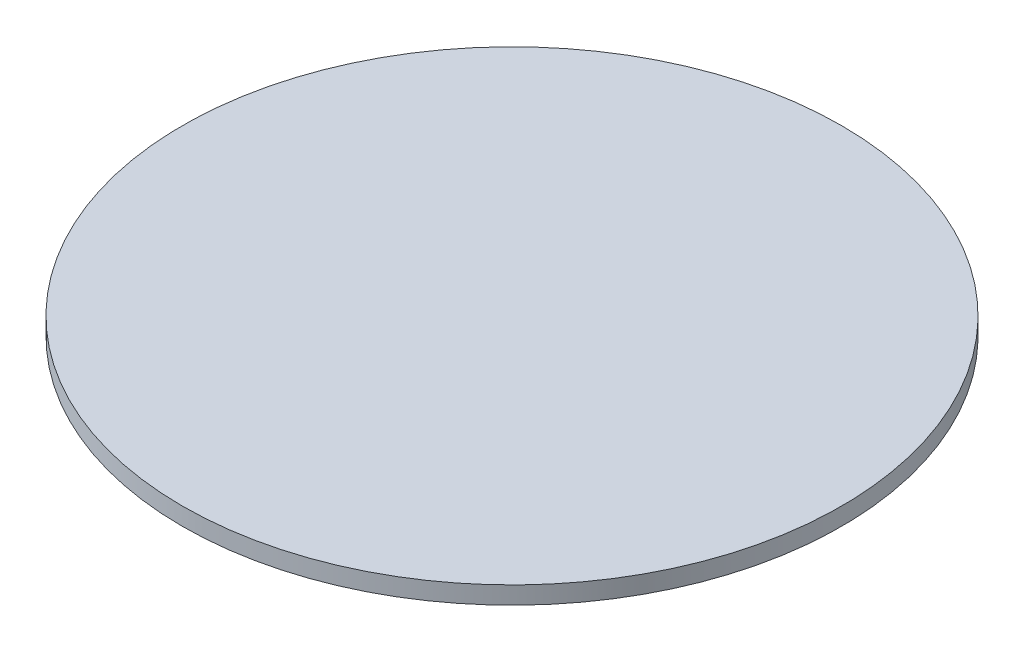
ISO-10303-21;
HEADER;
FILE_DESCRIPTION(('STEP AP214'),'2;1');
FILE_NAME('part.step','',(''),(''),'','','');
FILE_SCHEMA(('AUTOMOTIVE_DESIGN { 1 0 10303 214 1 1 1 1 }'));
ENDSEC;
DATA;
#1=APPLICATION_CONTEXT('core data for automotive mechanical design processes');
#2=APPLICATION_PROTOCOL_DEFINITION('international standard','automotive_design',2000,#1);
#3=PRODUCT_CONTEXT('',#1,'mechanical');
#4=PRODUCT('Part','Part','',(#3));
#5=PRODUCT_RELATED_PRODUCT_CATEGORY('part','',(#4));
#6=PRODUCT_DEFINITION_FORMATION('','',#4);
#7=PRODUCT_DEFINITION_CONTEXT('part definition',#1,'design');
#8=PRODUCT_DEFINITION('design','',#6,#7);
#9=PRODUCT_DEFINITION_SHAPE('','',#8);
#10=(LENGTH_UNIT() NAMED_UNIT(*) SI_UNIT(.MILLI.,.METRE.));
#11=(NAMED_UNIT(*) PLANE_ANGLE_UNIT() SI_UNIT($,.RADIAN.));
#12=(NAMED_UNIT(*) SI_UNIT($,.STERADIAN.) SOLID_ANGLE_UNIT());
#13=UNCERTAINTY_MEASURE_WITH_UNIT(LENGTH_MEASURE(1.E-05),#10,'distance_accuracy_value','');
#14=(GEOMETRIC_REPRESENTATION_CONTEXT(3) GLOBAL_UNCERTAINTY_ASSIGNED_CONTEXT((#13)) GLOBAL_UNIT_ASSIGNED_CONTEXT((#10,
#11,#12)) REPRESENTATION_CONTEXT('',''));
#15=CARTESIAN_POINT('',(0.,0.,0.));
#16=DIRECTION('',(0.,0.,1.));
#17=DIRECTION('',(1.,0.,0.));
#18=AXIS2_PLACEMENT_3D('',#15,#16,#17);
#19=CARTESIAN_POINT('',(0.,4.,0.));
#20=DIRECTION('',(0.,-1.,0.));
#21=DIRECTION('',(0.,0.,-1.));
#22=AXIS2_PLACEMENT_3D('',#19,#20,#21);
#23=CYLINDRICAL_SURFACE('',#22,75.);
#24=CARTESIAN_POINT('',(0.,4.,0.));
#25=DIRECTION('',(0.,1.,0.));
#26=DIRECTION('',(0.,0.,1.));
#27=AXIS2_PLACEMENT_3D('',#24,#25,#26);
#28=CIRCLE('',#27,75.);
#29=CARTESIAN_POINT('',(0.,4.,75.));
#30=VERTEX_POINT('',#29);
#31=EDGE_CURVE('E10',#30,#30,#28,.T.);
#32=ORIENTED_EDGE('',*,*,#31,.F.);
#33=EDGE_LOOP('',(#32));
#34=FACE_BOUND('',#33,.T.);
#35=CARTESIAN_POINT('',(0.,0.,0.));
#36=DIRECTION('',(0.,1.,0.));
#37=DIRECTION('',(0.,0.,1.));
#38=AXIS2_PLACEMENT_3D('',#35,#36,#37);
#39=CIRCLE('',#38,75.);
#40=CARTESIAN_POINT('',(0.,0.,75.));
#41=VERTEX_POINT('',#40);
#42=EDGE_CURVE('E34',#41,#41,#39,.T.);
#43=ORIENTED_EDGE('',*,*,#42,.T.);
#44=EDGE_LOOP('',(#43));
#45=FACE_BOUND('',#44,.T.);
#46=ADVANCED_FACE('F31',(#34,#45),#23,.T.);
#47=CARTESIAN_POINT('',(0.,4.,0.));
#48=DIRECTION('',(0.,1.,0.));
#49=DIRECTION('',(0.,0.,1.));
#50=AXIS2_PLACEMENT_3D('',#47,#48,#49);
#51=PLANE('',#50);
#52=ORIENTED_EDGE('',*,*,#31,.T.);
#53=EDGE_LOOP('',(#52));
#54=FACE_BOUND('',#53,.T.);
#55=ADVANCED_FACE('F46',(#54),#51,.T.);
#56=CARTESIAN_POINT('',(0.,0.,0.));
#57=DIRECTION('',(0.,1.,0.));
#58=DIRECTION('',(0.,0.,1.));
#59=AXIS2_PLACEMENT_3D('',#56,#57,#58);
#60=PLANE('',#59);
#61=ORIENTED_EDGE('',*,*,#42,.F.);
#62=EDGE_LOOP('',(#61));
#63=FACE_BOUND('',#62,.T.);
#64=ADVANCED_FACE('F44',(#63),#60,.F.);
#65=CLOSED_SHELL('',(#46,#55,#64));
#66=MANIFOLD_SOLID_BREP('B2',#65);
#67=ADVANCED_BREP_SHAPE_REPRESENTATION('',(#18,#66),#14);
#68=SHAPE_DEFINITION_REPRESENTATION(#9,#67);
ENDSEC;
END-ISO-10303-21;
